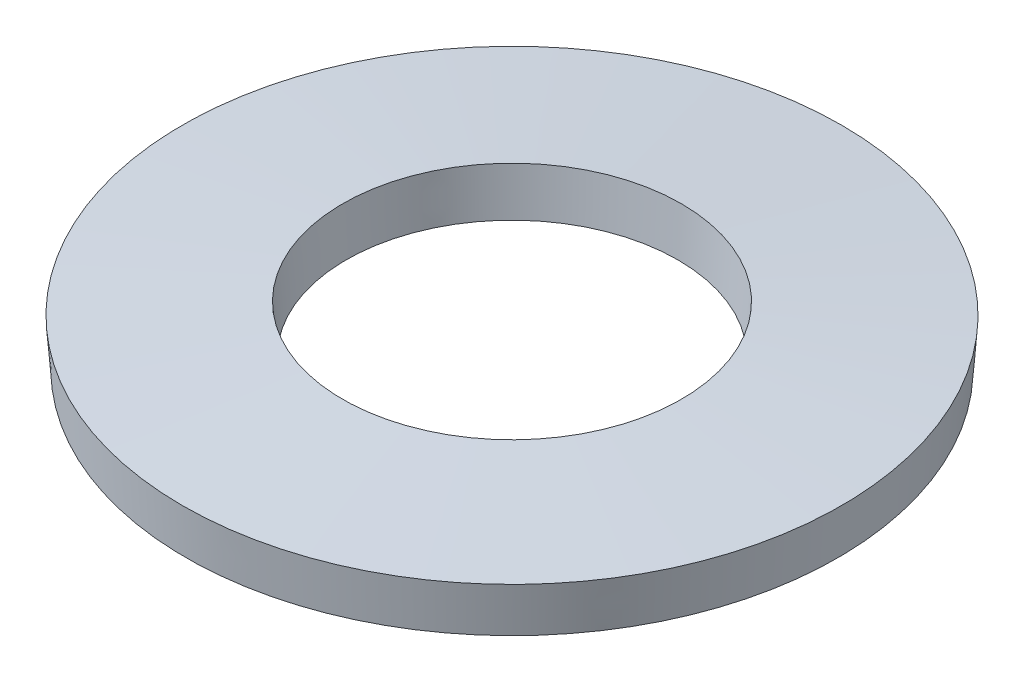
ISO-10303-21;
HEADER;
FILE_DESCRIPTION(('STEP AP214'),'2;1');
FILE_NAME('part.step','',(''),(''),'','','');
FILE_SCHEMA(('AUTOMOTIVE_DESIGN { 1 0 10303 214 1 1 1 1 }'));
ENDSEC;
DATA;
#1=APPLICATION_CONTEXT('core data for automotive mechanical design processes');
#2=APPLICATION_PROTOCOL_DEFINITION('international standard','automotive_design',2000,#1);
#3=PRODUCT_CONTEXT('',#1,'mechanical');
#4=PRODUCT('Part','Part','',(#3));
#5=PRODUCT_RELATED_PRODUCT_CATEGORY('part','',(#4));
#6=PRODUCT_DEFINITION_FORMATION('','',#4);
#7=PRODUCT_DEFINITION_CONTEXT('part definition',#1,'design');
#8=PRODUCT_DEFINITION('design','',#6,#7);
#9=PRODUCT_DEFINITION_SHAPE('','',#8);
#10=(LENGTH_UNIT() NAMED_UNIT(*) SI_UNIT(.MILLI.,.METRE.));
#11=(NAMED_UNIT(*) PLANE_ANGLE_UNIT() SI_UNIT($,.RADIAN.));
#12=(NAMED_UNIT(*) SI_UNIT($,.STERADIAN.) SOLID_ANGLE_UNIT());
#13=UNCERTAINTY_MEASURE_WITH_UNIT(LENGTH_MEASURE(1.E-05),#10,'distance_accuracy_value','');
#14=(GEOMETRIC_REPRESENTATION_CONTEXT(3) GLOBAL_UNCERTAINTY_ASSIGNED_CONTEXT((#13)) GLOBAL_UNIT_ASSIGNED_CONTEXT((#10,
#11,#12)) REPRESENTATION_CONTEXT('',''));
#15=CARTESIAN_POINT('',(0.,0.,0.));
#16=DIRECTION('',(0.,0.,1.));
#17=DIRECTION('',(1.,0.,0.));
#18=AXIS2_PLACEMENT_3D('',#15,#16,#17);
#19=CARTESIAN_POINT('',(0.,0.,0.));
#20=DIRECTION('',(0.,1.,0.));
#21=DIRECTION('',(0.,0.,1.));
#22=AXIS2_PLACEMENT_3D('',#19,#20,#21);
#23=CONICAL_SURFACE('',#22,18.8470268535778,0.0747524847870646);
#24=CARTESIAN_POINT('',(0.,2.71021009182526,0.));
#25=DIRECTION('',(0.,-1.,0.));
#26=DIRECTION('',(0.,0.,-1.));
#27=AXIS2_PLACEMENT_3D('',#24,#25,#26);
#28=CIRCLE('',#27,19.05);
#29=CARTESIAN_POINT('',(0.,2.71021009182526,-19.05));
#30=VERTEX_POINT('',#29);
#31=EDGE_CURVE('E10',#30,#30,#28,.T.);
#32=ORIENTED_EDGE('',*,*,#31,.T.);
#33=EDGE_LOOP('',(#32));
#34=FACE_BOUND('',#33,.T.);
#35=CARTESIAN_POINT('',(0.,0.,0.));
#36=DIRECTION('',(0.,-1.,0.));
#37=DIRECTION('',(0.,0.,-1.));
#38=AXIS2_PLACEMENT_3D('',#35,#36,#37);
#39=CIRCLE('',#38,18.8470268535778);
#40=CARTESIAN_POINT('',(0.,0.,-18.8470268535778));
#41=VERTEX_POINT('',#40);
#42=EDGE_CURVE('E54',#41,#41,#39,.T.);
#43=ORIENTED_EDGE('',*,*,#42,.F.);
#44=EDGE_LOOP('',(#43));
#45=FACE_BOUND('',#44,.T.);
#46=ADVANCED_FACE('F36',(#34,#45),#23,.T.);
#47=CARTESIAN_POINT('',(0.,2.71021009182526,0.));
#48=DIRECTION('',(0.,-1.,0.));
#49=DIRECTION('',(0.,0.,-1.));
#50=AXIS2_PLACEMENT_3D('',#47,#48,#49);
#51=CONICAL_SURFACE('',#50,19.05,1.49604384200783);
#52=CARTESIAN_POINT('',(0.,3.4036,0.));
#53=DIRECTION('',(0.,-1.,0.));
#54=DIRECTION('',(0.,0.,-1.));
#55=AXIS2_PLACEMENT_3D('',#52,#53,#54);
#56=CIRCLE('',#55,9.79147314642218);
#57=CARTESIAN_POINT('',(0.,3.4036,-9.79147314642218));
#58=VERTEX_POINT('',#57);
#59=EDGE_CURVE('E43',#58,#58,#56,.T.);
#60=ORIENTED_EDGE('',*,*,#59,.T.);
#61=EDGE_LOOP('',(#60));
#62=FACE_BOUND('',#61,.T.);
#63=ORIENTED_EDGE('',*,*,#31,.F.);
#64=EDGE_LOOP('',(#63));
#65=FACE_BOUND('',#64,.T.);
#66=ADVANCED_FACE('F64',(#62,#65),#51,.T.);
#67=CARTESIAN_POINT('',(0.,3.4036,0.));
#68=DIRECTION('',(0.,1.,0.));
#69=DIRECTION('',(0.,0.,1.));
#70=AXIS2_PLACEMENT_3D('',#67,#68,#69);
#71=CONICAL_SURFACE('',#70,9.79147314642218,0.0747524847870653);
#72=CARTESIAN_POINT('',(0.,0.69338990817474,0.));
#73=DIRECTION('',(0.,-1.,0.));
#74=DIRECTION('',(0.,0.,-1.));
#75=AXIS2_PLACEMENT_3D('',#72,#73,#74);
#76=CIRCLE('',#75,9.5885);
#77=CARTESIAN_POINT('',(0.,0.69338990817474,-9.5885));
#78=VERTEX_POINT('',#77);
#79=EDGE_CURVE('E49',#78,#78,#76,.T.);
#80=ORIENTED_EDGE('',*,*,#79,.T.);
#81=EDGE_LOOP('',(#80));
#82=FACE_BOUND('',#81,.T.);
#83=ORIENTED_EDGE('',*,*,#59,.F.);
#84=EDGE_LOOP('',(#83));
#85=FACE_BOUND('',#84,.T.);
#86=ADVANCED_FACE('F68',(#82,#85),#71,.F.);
#87=CARTESIAN_POINT('',(0.,0.69338990817474,0.));
#88=DIRECTION('',(0.,-1.,0.));
#89=DIRECTION('',(0.,0.,-1.));
#90=AXIS2_PLACEMENT_3D('',#87,#88,#89);
#91=CONICAL_SURFACE('',#90,9.5885,1.49604384200783);
#92=ORIENTED_EDGE('',*,*,#42,.T.);
#93=EDGE_LOOP('',(#92));
#94=FACE_BOUND('',#93,.T.);
#95=ORIENTED_EDGE('',*,*,#79,.F.);
#96=EDGE_LOOP('',(#95));
#97=FACE_BOUND('',#96,.T.);
#98=ADVANCED_FACE('F60',(#94,#97),#91,.F.);
#99=CLOSED_SHELL('',(#46,#66,#86,#98));
#100=MANIFOLD_SOLID_BREP('B2',#99);
#101=ADVANCED_BREP_SHAPE_REPRESENTATION('',(#18,#100),#14);
#102=SHAPE_DEFINITION_REPRESENTATION(#9,#101);
ENDSEC;
END-ISO-10303-21;
